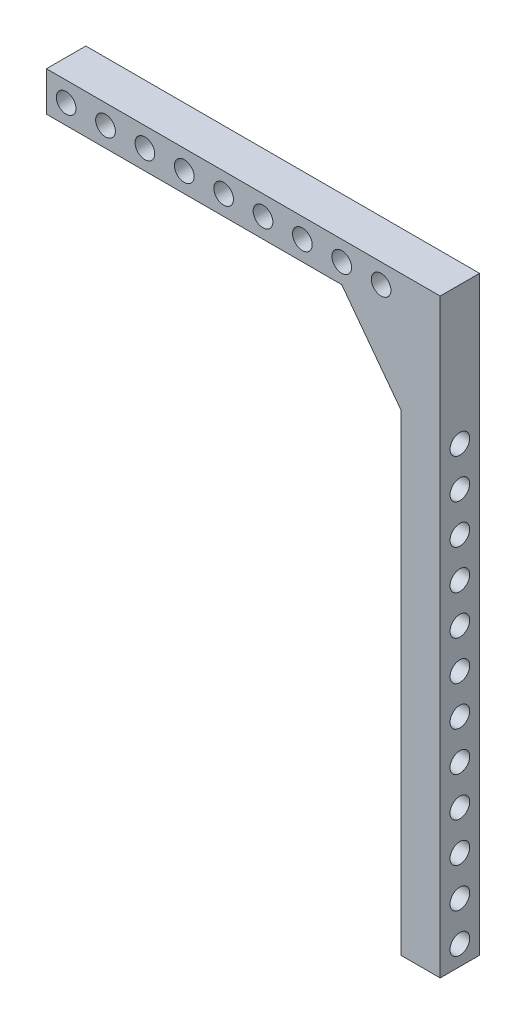
ISO-10303-21;
HEADER;
FILE_DESCRIPTION(('STEP AP214'),'2;1');
FILE_NAME('part.step','',(''),(''),'','','');
FILE_SCHEMA(('AUTOMOTIVE_DESIGN { 1 0 10303 214 1 1 1 1 }'));
ENDSEC;
DATA;
#1=APPLICATION_CONTEXT('core data for automotive mechanical design processes');
#2=APPLICATION_PROTOCOL_DEFINITION('international standard','automotive_design',2000,#1);
#3=PRODUCT_CONTEXT('',#1,'mechanical');
#4=PRODUCT('Part','Part','',(#3));
#5=PRODUCT_RELATED_PRODUCT_CATEGORY('part','',(#4));
#6=PRODUCT_DEFINITION_FORMATION('','',#4);
#7=PRODUCT_DEFINITION_CONTEXT('part definition',#1,'design');
#8=PRODUCT_DEFINITION('design','',#6,#7);
#9=PRODUCT_DEFINITION_SHAPE('','',#8);
#10=(LENGTH_UNIT() NAMED_UNIT(*) SI_UNIT(.MILLI.,.METRE.));
#11=(NAMED_UNIT(*) PLANE_ANGLE_UNIT() SI_UNIT($,.RADIAN.));
#12=(NAMED_UNIT(*) SI_UNIT($,.STERADIAN.) SOLID_ANGLE_UNIT());
#13=UNCERTAINTY_MEASURE_WITH_UNIT(LENGTH_MEASURE(1.E-05),#10,'distance_accuracy_value','');
#14=(GEOMETRIC_REPRESENTATION_CONTEXT(3) GLOBAL_UNCERTAINTY_ASSIGNED_CONTEXT((#13)) GLOBAL_UNIT_ASSIGNED_CONTEXT((#10,
#11,#12)) REPRESENTATION_CONTEXT('',''));
#15=CARTESIAN_POINT('',(0.,0.,0.));
#16=DIRECTION('',(0.,0.,1.));
#17=DIRECTION('',(1.,0.,0.));
#18=AXIS2_PLACEMENT_3D('',#15,#16,#17);
#19=CARTESIAN_POINT('',(90.,-5.,-5.));
#20=DIRECTION('',(0.,0.,1.));
#21=DIRECTION('',(1.,0.,0.));
#22=AXIS2_PLACEMENT_3D('',#19,#20,#21);
#23=PLANE('',#22);
#24=DIRECTION('',(-0.6,0.8,0.));
#25=VECTOR('',#24,1.);
#26=CARTESIAN_POINT('',(75.,-5.,-5.));
#27=LINE('',#26,#25);
#28=CARTESIAN_POINT('',(90.,-25.,-5.));
#29=VERTEX_POINT('',#28);
#30=CARTESIAN_POINT('',(75.,-5.,-5.));
#31=VERTEX_POINT('',#30);
#32=EDGE_CURVE('E102',#29,#31,#27,.T.);
#33=ORIENTED_EDGE('',*,*,#32,.T.);
#34=DIRECTION('',(-1.,0.,0.));
#35=VECTOR('',#34,1.);
#36=CARTESIAN_POINT('',(90.,-5.,-5.));
#37=LINE('',#36,#35);
#38=CARTESIAN_POINT('',(0.,-5.,-5.));
#39=VERTEX_POINT('',#38);
#40=EDGE_CURVE('E67',#31,#39,#37,.T.);
#41=ORIENTED_EDGE('',*,*,#40,.T.);
#42=DIRECTION('',(0.,1.,0.));
#43=VECTOR('',#42,1.);
#44=CARTESIAN_POINT('',(0.,-5.,-5.));
#45=LINE('',#44,#43);
#46=CARTESIAN_POINT('',(0.,5.,-5.));
#47=VERTEX_POINT('',#46);
#48=EDGE_CURVE('E135',#39,#47,#45,.T.);
#49=ORIENTED_EDGE('',*,*,#48,.T.);
#50=DIRECTION('',(-1.,0.,0.));
#51=VECTOR('',#50,1.);
#52=CARTESIAN_POINT('',(90.,5.,-5.));
#53=LINE('',#52,#51);
#54=CARTESIAN_POINT('',(100.,5.,-5.));
#55=VERTEX_POINT('',#54);
#56=EDGE_CURVE('E13',#55,#47,#53,.T.);
#57=ORIENTED_EDGE('',*,*,#56,.F.);
#58=DIRECTION('',(0.,1.,0.));
#59=VECTOR('',#58,1.);
#60=CARTESIAN_POINT('',(100.,5.,-5.));
#61=LINE('',#60,#59);
#62=CARTESIAN_POINT('',(100.,-145.,-5.00000000000002));
#63=VERTEX_POINT('',#62);
#64=EDGE_CURVE('E294',#63,#55,#61,.T.);
#65=ORIENTED_EDGE('',*,*,#64,.F.);
#66=DIRECTION('',(-1.,0.,0.));
#67=VECTOR('',#66,1.);
#68=CARTESIAN_POINT('',(100.,-145.,-5.00000000000002));
#69=LINE('',#68,#67);
#70=CARTESIAN_POINT('',(90.,-145.,-5.00000000000002));
#71=VERTEX_POINT('',#70);
#72=EDGE_CURVE('E120',#63,#71,#69,.T.);
#73=ORIENTED_EDGE('',*,*,#72,.T.);
#74=DIRECTION('',(0.,1.,0.));
#75=VECTOR('',#74,1.);
#76=CARTESIAN_POINT('',(90.,5.,-5.));
#77=LINE('',#76,#75);
#78=EDGE_CURVE('E113',#71,#29,#77,.T.);
#79=ORIENTED_EDGE('',*,*,#78,.T.);
#80=EDGE_LOOP('',(#33,#41,#49,#57,#65,#73,#79));
#81=FACE_BOUND('',#80,.T.);
#82=CARTESIAN_POINT('',(15.,0.,-5.));
#83=DIRECTION('',(0.,0.,-1.));
#84=DIRECTION('',(-1.,0.,0.));
#85=AXIS2_PLACEMENT_3D('',#82,#83,#84);
#86=CIRCLE('',#85,2.5);
#87=CARTESIAN_POINT('',(12.5,0.,-5.));
#88=VERTEX_POINT('',#87);
#89=EDGE_CURVE('E171',#88,#88,#86,.T.);
#90=ORIENTED_EDGE('',*,*,#89,.F.);
#91=EDGE_LOOP('',(#90));
#92=FACE_BOUND('',#91,.T.);
#93=CARTESIAN_POINT('',(25.,-1.40271576953299E-13,-5.));
#94=DIRECTION('',(0.,0.,-1.));
#95=DIRECTION('',(-1.,0.,0.));
#96=AXIS2_PLACEMENT_3D('',#93,#94,#95);
#97=CIRCLE('',#96,2.5);
#98=CARTESIAN_POINT('',(22.5,-1.40271576953299E-13,-5.));
#99=VERTEX_POINT('',#98);
#100=EDGE_CURVE('E179',#99,#99,#97,.T.);
#101=ORIENTED_EDGE('',*,*,#100,.F.);
#102=EDGE_LOOP('',(#101));
#103=FACE_BOUND('',#102,.T.);
#104=CARTESIAN_POINT('',(35.,-2.10101203730162E-13,-5.));
#105=DIRECTION('',(0.,0.,-1.));
#106=DIRECTION('',(-1.,0.,0.));
#107=AXIS2_PLACEMENT_3D('',#104,#105,#106);
#108=CIRCLE('',#107,2.5);
#109=CARTESIAN_POINT('',(32.5,-2.10101203730162E-13,-5.));
#110=VERTEX_POINT('',#109);
#111=EDGE_CURVE('E185',#110,#110,#108,.T.);
#112=ORIENTED_EDGE('',*,*,#111,.F.);
#113=EDGE_LOOP('',(#112));
#114=FACE_BOUND('',#113,.T.);
#115=CARTESIAN_POINT('',(45.,-2.79930830507024E-13,-5.));
#116=DIRECTION('',(0.,0.,-1.));
#117=DIRECTION('',(-1.,0.,0.));
#118=AXIS2_PLACEMENT_3D('',#115,#116,#117);
#119=CIRCLE('',#118,2.5);
#120=CARTESIAN_POINT('',(42.5,-2.79930830507024E-13,-5.));
#121=VERTEX_POINT('',#120);
#122=EDGE_CURVE('E191',#121,#121,#119,.T.);
#123=ORIENTED_EDGE('',*,*,#122,.F.);
#124=EDGE_LOOP('',(#123));
#125=FACE_BOUND('',#124,.T.);
#126=CARTESIAN_POINT('',(55.,-3.49760457283887E-13,-5.));
#127=DIRECTION('',(0.,0.,-1.));
#128=DIRECTION('',(-1.,0.,0.));
#129=AXIS2_PLACEMENT_3D('',#126,#127,#128);
#130=CIRCLE('',#129,2.5);
#131=CARTESIAN_POINT('',(52.5,-3.49760457283887E-13,-5.));
#132=VERTEX_POINT('',#131);
#133=EDGE_CURVE('E197',#132,#132,#130,.T.);
#134=ORIENTED_EDGE('',*,*,#133,.F.);
#135=EDGE_LOOP('',(#134));
#136=FACE_BOUND('',#135,.T.);
#137=CARTESIAN_POINT('',(65.,-4.1959008406075E-13,-5.));
#138=DIRECTION('',(0.,0.,-1.));
#139=DIRECTION('',(-1.,0.,0.));
#140=AXIS2_PLACEMENT_3D('',#137,#138,#139);
#141=CIRCLE('',#140,2.50000000000001);
#142=CARTESIAN_POINT('',(62.5,-4.1959008406075E-13,-5.));
#143=VERTEX_POINT('',#142);
#144=EDGE_CURVE('E203',#143,#143,#141,.T.);
#145=ORIENTED_EDGE('',*,*,#144,.F.);
#146=EDGE_LOOP('',(#145));
#147=FACE_BOUND('',#146,.T.);
#148=CARTESIAN_POINT('',(75.,-4.89419710837612E-13,-5.));
#149=DIRECTION('',(0.,0.,-1.));
#150=DIRECTION('',(-1.,0.,0.));
#151=AXIS2_PLACEMENT_3D('',#148,#149,#150);
#152=CIRCLE('',#151,2.50000000000001);
#153=CARTESIAN_POINT('',(72.5,-4.89419710837612E-13,-5.));
#154=VERTEX_POINT('',#153);
#155=EDGE_CURVE('E209',#154,#154,#152,.T.);
#156=ORIENTED_EDGE('',*,*,#155,.F.);
#157=EDGE_LOOP('',(#156));
#158=FACE_BOUND('',#157,.T.);
#159=CARTESIAN_POINT('',(85.,-5.59249337614475E-13,-5.));
#160=DIRECTION('',(0.,0.,-1.));
#161=DIRECTION('',(-1.,0.,0.));
#162=AXIS2_PLACEMENT_3D('',#159,#160,#161);
#163=CIRCLE('',#162,2.50000000000001);
#164=CARTESIAN_POINT('',(82.5,-5.59249337614475E-13,-5.));
#165=VERTEX_POINT('',#164);
#166=EDGE_CURVE('E164',#165,#165,#163,.T.);
#167=ORIENTED_EDGE('',*,*,#166,.F.);
#168=EDGE_LOOP('',(#167));
#169=FACE_BOUND('',#168,.T.);
#170=CARTESIAN_POINT('',(5.,0.,-5.));
#171=DIRECTION('',(0.,0.,-1.));
#172=DIRECTION('',(-1.,0.,0.));
#173=AXIS2_PLACEMENT_3D('',#170,#171,#172);
#174=CIRCLE('',#173,2.5);
#175=CARTESIAN_POINT('',(2.5,0.,-5.));
#176=VERTEX_POINT('',#175);
#177=EDGE_CURVE('E178',#176,#176,#174,.T.);
#178=ORIENTED_EDGE('',*,*,#177,.F.);
#179=EDGE_LOOP('',(#178));
#180=FACE_BOUND('',#179,.T.);
#181=ADVANCED_FACE('F45',(#81,#92,#103,#114,#125,#136,#147,#158,#169,#180),#23,.F.);
#182=CARTESIAN_POINT('',(90.,5.,5.));
#183=DIRECTION('',(0.,-1.,0.));
#184=DIRECTION('',(0.,0.,-1.));
#185=AXIS2_PLACEMENT_3D('',#182,#183,#184);
#186=PLANE('',#185);
#187=DIRECTION('',(0.,0.,1.));
#188=VECTOR('',#187,1.);
#189=CARTESIAN_POINT('',(0.,5.,5.));
#190=LINE('',#189,#188);
#191=CARTESIAN_POINT('',(0.,5.,5.));
#192=VERTEX_POINT('',#191);
#193=EDGE_CURVE('E137',#47,#192,#190,.T.);
#194=ORIENTED_EDGE('',*,*,#193,.T.);
#195=DIRECTION('',(-1.,0.,0.));
#196=VECTOR('',#195,1.);
#197=CARTESIAN_POINT('',(90.,5.,5.));
#198=LINE('',#197,#196);
#199=CARTESIAN_POINT('',(100.,5.,5.));
#200=VERTEX_POINT('',#199);
#201=EDGE_CURVE('E52',#200,#192,#198,.T.);
#202=ORIENTED_EDGE('',*,*,#201,.F.);
#203=DIRECTION('',(0.,0.,1.));
#204=VECTOR('',#203,1.);
#205=CARTESIAN_POINT('',(100.,5.,5.));
#206=LINE('',#205,#204);
#207=EDGE_CURVE('E132',#55,#200,#206,.T.);
#208=ORIENTED_EDGE('',*,*,#207,.F.);
#209=ORIENTED_EDGE('',*,*,#56,.T.);
#210=EDGE_LOOP('',(#194,#202,#208,#209));
#211=FACE_BOUND('',#210,.T.);
#212=ADVANCED_FACE('F300',(#211),#186,.F.);
#213=CARTESIAN_POINT('',(90.,-5.,5.));
#214=DIRECTION('',(0.,0.,-1.));
#215=DIRECTION('',(-1.,0.,0.));
#216=AXIS2_PLACEMENT_3D('',#213,#214,#215);
#217=PLANE('',#216);
#218=DIRECTION('',(-1.,0.,0.));
#219=VECTOR('',#218,1.);
#220=CARTESIAN_POINT('',(90.,-5.,5.));
#221=LINE('',#220,#219);
#222=CARTESIAN_POINT('',(75.,-5.,5.));
#223=VERTEX_POINT('',#222);
#224=CARTESIAN_POINT('',(0.,-5.,5.));
#225=VERTEX_POINT('',#224);
#226=EDGE_CURVE('E145',#223,#225,#221,.T.);
#227=ORIENTED_EDGE('',*,*,#226,.F.);
#228=DIRECTION('',(0.6,-0.8,0.));
#229=VECTOR('',#228,1.);
#230=CARTESIAN_POINT('',(75.,-5.,5.));
#231=LINE('',#230,#229);
#232=CARTESIAN_POINT('',(90.,-25.,5.));
#233=VERTEX_POINT('',#232);
#234=EDGE_CURVE('E163',#223,#233,#231,.T.);
#235=ORIENTED_EDGE('',*,*,#234,.T.);
#236=DIRECTION('',(0.,-1.,0.));
#237=VECTOR('',#236,1.);
#238=CARTESIAN_POINT('',(90.,5.,5.));
#239=LINE('',#238,#237);
#240=CARTESIAN_POINT('',(90.,-145.,4.99999999999998));
#241=VERTEX_POINT('',#240);
#242=EDGE_CURVE('E114',#233,#241,#239,.T.);
#243=ORIENTED_EDGE('',*,*,#242,.T.);
#244=DIRECTION('',(-1.,0.,0.));
#245=VECTOR('',#244,1.);
#246=CARTESIAN_POINT('',(100.,-145.,4.99999999999998));
#247=LINE('',#246,#245);
#248=CARTESIAN_POINT('',(100.,-145.,4.99999999999998));
#249=VERTEX_POINT('',#248);
#250=EDGE_CURVE('E131',#249,#241,#247,.T.);
#251=ORIENTED_EDGE('',*,*,#250,.F.);
#252=DIRECTION('',(0.,-1.,0.));
#253=VECTOR('',#252,1.);
#254=CARTESIAN_POINT('',(100.,5.,5.));
#255=LINE('',#254,#253);
#256=EDGE_CURVE('E121',#200,#249,#255,.T.);
#257=ORIENTED_EDGE('',*,*,#256,.F.);
#258=ORIENTED_EDGE('',*,*,#201,.T.);
#259=DIRECTION('',(0.,-1.,0.));
#260=VECTOR('',#259,1.);
#261=CARTESIAN_POINT('',(0.,-5.,5.));
#262=LINE('',#261,#260);
#263=EDGE_CURVE('E139',#192,#225,#262,.T.);
#264=ORIENTED_EDGE('',*,*,#263,.T.);
#265=EDGE_LOOP('',(#227,#235,#243,#251,#257,#258,#264));
#266=FACE_BOUND('',#265,.T.);
#267=CARTESIAN_POINT('',(15.,0.,5.));
#268=DIRECTION('',(0.,0.,-1.));
#269=DIRECTION('',(-1.,0.,0.));
#270=AXIS2_PLACEMENT_3D('',#267,#268,#269);
#271=CIRCLE('',#270,2.5);
#272=CARTESIAN_POINT('',(12.5,0.,5.));
#273=VERTEX_POINT('',#272);
#274=EDGE_CURVE('E174',#273,#273,#271,.F.);
#275=ORIENTED_EDGE('',*,*,#274,.F.);
#276=EDGE_LOOP('',(#275));
#277=FACE_BOUND('',#276,.T.);
#278=CARTESIAN_POINT('',(25.,-1.40271576953299E-13,5.));
#279=DIRECTION('',(0.,0.,-1.));
#280=DIRECTION('',(-1.,0.,0.));
#281=AXIS2_PLACEMENT_3D('',#278,#279,#280);
#282=CIRCLE('',#281,2.5);
#283=CARTESIAN_POINT('',(22.5,-1.40271576953299E-13,5.));
#284=VERTEX_POINT('',#283);
#285=EDGE_CURVE('E175',#284,#284,#282,.F.);
#286=ORIENTED_EDGE('',*,*,#285,.F.);
#287=EDGE_LOOP('',(#286));
#288=FACE_BOUND('',#287,.T.);
#289=CARTESIAN_POINT('',(35.,-2.10101203730162E-13,5.));
#290=DIRECTION('',(0.,0.,-1.));
#291=DIRECTION('',(-1.,0.,0.));
#292=AXIS2_PLACEMENT_3D('',#289,#290,#291);
#293=CIRCLE('',#292,2.5);
#294=CARTESIAN_POINT('',(32.5,-2.10101203730162E-13,5.));
#295=VERTEX_POINT('',#294);
#296=EDGE_CURVE('E182',#295,#295,#293,.F.);
#297=ORIENTED_EDGE('',*,*,#296,.F.);
#298=EDGE_LOOP('',(#297));
#299=FACE_BOUND('',#298,.T.);
#300=CARTESIAN_POINT('',(45.,-2.79930830507024E-13,5.));
#301=DIRECTION('',(0.,0.,-1.));
#302=DIRECTION('',(-1.,0.,0.));
#303=AXIS2_PLACEMENT_3D('',#300,#301,#302);
#304=CIRCLE('',#303,2.5);
#305=CARTESIAN_POINT('',(42.5,-2.79930830507024E-13,5.));
#306=VERTEX_POINT('',#305);
#307=EDGE_CURVE('E188',#306,#306,#304,.F.);
#308=ORIENTED_EDGE('',*,*,#307,.F.);
#309=EDGE_LOOP('',(#308));
#310=FACE_BOUND('',#309,.T.);
#311=CARTESIAN_POINT('',(55.,-3.49760457283887E-13,5.));
#312=DIRECTION('',(0.,0.,-1.));
#313=DIRECTION('',(-1.,0.,0.));
#314=AXIS2_PLACEMENT_3D('',#311,#312,#313);
#315=CIRCLE('',#314,2.5);
#316=CARTESIAN_POINT('',(52.5,-3.49760457283887E-13,5.));
#317=VERTEX_POINT('',#316);
#318=EDGE_CURVE('E194',#317,#317,#315,.F.);
#319=ORIENTED_EDGE('',*,*,#318,.F.);
#320=EDGE_LOOP('',(#319));
#321=FACE_BOUND('',#320,.T.);
#322=CARTESIAN_POINT('',(65.,-4.1959008406075E-13,5.));
#323=DIRECTION('',(0.,0.,-1.));
#324=DIRECTION('',(-1.,0.,0.));
#325=AXIS2_PLACEMENT_3D('',#322,#323,#324);
#326=CIRCLE('',#325,2.50000000000001);
#327=CARTESIAN_POINT('',(62.5,-4.1959008406075E-13,5.));
#328=VERTEX_POINT('',#327);
#329=EDGE_CURVE('E200',#328,#328,#326,.F.);
#330=ORIENTED_EDGE('',*,*,#329,.F.);
#331=EDGE_LOOP('',(#330));
#332=FACE_BOUND('',#331,.T.);
#333=CARTESIAN_POINT('',(75.,-4.89419710837612E-13,5.));
#334=DIRECTION('',(0.,0.,-1.));
#335=DIRECTION('',(-1.,0.,0.));
#336=AXIS2_PLACEMENT_3D('',#333,#334,#335);
#337=CIRCLE('',#336,2.50000000000001);
#338=CARTESIAN_POINT('',(72.5,-4.89419710837612E-13,5.));
#339=VERTEX_POINT('',#338);
#340=EDGE_CURVE('E206',#339,#339,#337,.F.);
#341=ORIENTED_EDGE('',*,*,#340,.F.);
#342=EDGE_LOOP('',(#341));
#343=FACE_BOUND('',#342,.T.);
#344=CARTESIAN_POINT('',(85.,-5.59249337614475E-13,5.));
#345=DIRECTION('',(0.,0.,-1.));
#346=DIRECTION('',(-1.,0.,0.));
#347=AXIS2_PLACEMENT_3D('',#344,#345,#346);
#348=CIRCLE('',#347,2.50000000000001);
#349=CARTESIAN_POINT('',(82.5,-5.59249337614475E-13,5.));
#350=VERTEX_POINT('',#349);
#351=EDGE_CURVE('E167',#350,#350,#348,.F.);
#352=ORIENTED_EDGE('',*,*,#351,.F.);
#353=EDGE_LOOP('',(#352));
#354=FACE_BOUND('',#353,.T.);
#355=CARTESIAN_POINT('',(5.,0.,5.));
#356=DIRECTION('',(0.,0.,-1.));
#357=DIRECTION('',(-1.,0.,0.));
#358=AXIS2_PLACEMENT_3D('',#355,#356,#357);
#359=CIRCLE('',#358,2.5);
#360=CARTESIAN_POINT('',(2.5,0.,5.));
#361=VERTEX_POINT('',#360);
#362=EDGE_CURVE('E218',#361,#361,#359,.F.);
#363=ORIENTED_EDGE('',*,*,#362,.F.);
#364=EDGE_LOOP('',(#363));
#365=FACE_BOUND('',#364,.T.);
#366=ADVANCED_FACE('F151',(#266,#277,#288,#299,#310,#321,#332,#343,#354,#365),#217,.F.);
#367=CARTESIAN_POINT('',(90.,-5.,5.));
#368=DIRECTION('',(0.,1.,0.));
#369=DIRECTION('',(0.,0.,1.));
#370=AXIS2_PLACEMENT_3D('',#367,#368,#369);
#371=PLANE('',#370);
#372=ORIENTED_EDGE('',*,*,#40,.F.);
#373=DIRECTION('',(0.,0.,-1.));
#374=VECTOR('',#373,1.);
#375=CARTESIAN_POINT('',(75.,-5.,30.));
#376=LINE('',#375,#374);
#377=EDGE_CURVE('E105',#223,#31,#376,.T.);
#378=ORIENTED_EDGE('',*,*,#377,.F.);
#379=ORIENTED_EDGE('',*,*,#226,.T.);
#380=DIRECTION('',(0.,0.,-1.));
#381=VECTOR('',#380,1.);
#382=CARTESIAN_POINT('',(0.,-5.,5.));
#383=LINE('',#382,#381);
#384=EDGE_CURVE('E142',#225,#39,#383,.T.);
#385=ORIENTED_EDGE('',*,*,#384,.T.);
#386=EDGE_LOOP('',(#372,#378,#379,#385));
#387=FACE_BOUND('',#386,.T.);
#388=ADVANCED_FACE('F162',(#387),#371,.F.);
#389=CARTESIAN_POINT('',(0.,0.,0.));
#390=DIRECTION('',(-1.,0.,0.));
#391=DIRECTION('',(0.,0.,1.));
#392=AXIS2_PLACEMENT_3D('',#389,#390,#391);
#393=PLANE('',#392);
#394=ORIENTED_EDGE('',*,*,#48,.F.);
#395=ORIENTED_EDGE('',*,*,#384,.F.);
#396=ORIENTED_EDGE('',*,*,#263,.F.);
#397=ORIENTED_EDGE('',*,*,#193,.F.);
#398=EDGE_LOOP('',(#394,#395,#396,#397));
#399=FACE_BOUND('',#398,.T.);
#400=ADVANCED_FACE('F160',(#399),#393,.T.);
#401=CARTESIAN_POINT('',(90.,0.,0.));
#402=DIRECTION('',(1.,0.,0.));
#403=DIRECTION('',(0.,0.,-1.));
#404=AXIS2_PLACEMENT_3D('',#401,#402,#403);
#405=PLANE('',#404);
#406=CARTESIAN_POINT('',(90.,-140.,0.));
#407=DIRECTION('',(1.,0.,0.));
#408=DIRECTION('',(0.,0.,-1.));
#409=AXIS2_PLACEMENT_3D('',#406,#407,#408);
#410=CIRCLE('',#409,2.5);
#411=CARTESIAN_POINT('',(90.,-140.,-2.5));
#412=VERTEX_POINT('',#411);
#413=EDGE_CURVE('E285',#412,#412,#410,.T.);
#414=ORIENTED_EDGE('',*,*,#413,.T.);
#415=EDGE_LOOP('',(#414));
#416=FACE_BOUND('',#415,.T.);
#417=CARTESIAN_POINT('',(90.,-40.,3.49148133884313E-13));
#418=DIRECTION('',(1.,0.,0.));
#419=DIRECTION('',(0.,0.,-1.));
#420=AXIS2_PLACEMENT_3D('',#417,#418,#419);
#421=CIRCLE('',#420,2.5);
#422=CARTESIAN_POINT('',(90.,-40.,-2.49999999999965));
#423=VERTEX_POINT('',#422);
#424=EDGE_CURVE('E279',#423,#423,#421,.T.);
#425=ORIENTED_EDGE('',*,*,#424,.T.);
#426=EDGE_LOOP('',(#425));
#427=FACE_BOUND('',#426,.T.);
#428=CARTESIAN_POINT('',(90.,-130.,0.));
#429=DIRECTION('',(1.,0.,0.));
#430=DIRECTION('',(0.,0.,-1.));
#431=AXIS2_PLACEMENT_3D('',#428,#429,#430);
#432=CIRCLE('',#431,2.5);
#433=CARTESIAN_POINT('',(90.,-130.,-2.49999999999997));
#434=VERTEX_POINT('',#433);
#435=EDGE_CURVE('E273',#434,#434,#432,.T.);
#436=ORIENTED_EDGE('',*,*,#435,.T.);
#437=EDGE_LOOP('',(#436));
#438=FACE_BOUND('',#437,.T.);
#439=CARTESIAN_POINT('',(90.,-120.,0.));
#440=DIRECTION('',(1.,0.,0.));
#441=DIRECTION('',(0.,0.,-1.));
#442=AXIS2_PLACEMENT_3D('',#439,#440,#441);
#443=CIRCLE('',#442,2.5);
#444=CARTESIAN_POINT('',(90.,-120.,-2.49999999999993));
#445=VERTEX_POINT('',#444);
#446=EDGE_CURVE('E267',#445,#445,#443,.T.);
#447=ORIENTED_EDGE('',*,*,#446,.T.);
#448=EDGE_LOOP('',(#447));
#449=FACE_BOUND('',#448,.T.);
#450=CARTESIAN_POINT('',(90.,-110.,1.04744440165294E-13));
#451=DIRECTION('',(1.,0.,0.));
#452=DIRECTION('',(0.,0.,-1.));
#453=AXIS2_PLACEMENT_3D('',#450,#451,#452);
#454=CIRCLE('',#453,2.5);
#455=CARTESIAN_POINT('',(90.,-110.,-2.4999999999999));
#456=VERTEX_POINT('',#455);
#457=EDGE_CURVE('E261',#456,#456,#454,.T.);
#458=ORIENTED_EDGE('',*,*,#457,.T.);
#459=EDGE_LOOP('',(#458));
#460=FACE_BOUND('',#459,.T.);
#461=CARTESIAN_POINT('',(90.,-100.,1.39659253553725E-13));
#462=DIRECTION('',(1.,0.,0.));
#463=DIRECTION('',(0.,0.,-1.));
#464=AXIS2_PLACEMENT_3D('',#461,#462,#463);
#465=CIRCLE('',#464,2.5);
#466=CARTESIAN_POINT('',(90.,-100.,-2.49999999999986));
#467=VERTEX_POINT('',#466);
#468=EDGE_CURVE('E255',#467,#467,#465,.T.);
#469=ORIENTED_EDGE('',*,*,#468,.T.);
#470=EDGE_LOOP('',(#469));
#471=FACE_BOUND('',#470,.T.);
#472=CARTESIAN_POINT('',(90.,-90.,1.74574066942157E-13));
#473=DIRECTION('',(1.,0.,0.));
#474=DIRECTION('',(0.,0.,-1.));
#475=AXIS2_PLACEMENT_3D('',#472,#473,#474);
#476=CIRCLE('',#475,2.5);
#477=CARTESIAN_POINT('',(90.,-90.,-2.49999999999983));
#478=VERTEX_POINT('',#477);
#479=EDGE_CURVE('E249',#478,#478,#476,.T.);
#480=ORIENTED_EDGE('',*,*,#479,.T.);
#481=EDGE_LOOP('',(#480));
#482=FACE_BOUND('',#481,.T.);
#483=CARTESIAN_POINT('',(90.,-80.,2.09488880330588E-13));
#484=DIRECTION('',(1.,0.,0.));
#485=DIRECTION('',(0.,0.,-1.));
#486=AXIS2_PLACEMENT_3D('',#483,#484,#485);
#487=CIRCLE('',#486,2.5);
#488=CARTESIAN_POINT('',(90.,-80.,-2.49999999999979));
#489=VERTEX_POINT('',#488);
#490=EDGE_CURVE('E243',#489,#489,#487,.T.);
#491=ORIENTED_EDGE('',*,*,#490,.T.);
#492=EDGE_LOOP('',(#491));
#493=FACE_BOUND('',#492,.T.);
#494=CARTESIAN_POINT('',(90.,-70.,2.44403693719019E-13));
#495=DIRECTION('',(1.,0.,0.));
#496=DIRECTION('',(0.,0.,-1.));
#497=AXIS2_PLACEMENT_3D('',#494,#495,#496);
#498=CIRCLE('',#497,2.5);
#499=CARTESIAN_POINT('',(90.,-70.,-2.49999999999976));
#500=VERTEX_POINT('',#499);
#501=EDGE_CURVE('E237',#500,#500,#498,.T.);
#502=ORIENTED_EDGE('',*,*,#501,.T.);
#503=EDGE_LOOP('',(#502));
#504=FACE_BOUND('',#503,.T.);
#505=CARTESIAN_POINT('',(90.,-60.,2.79318507107451E-13));
#506=DIRECTION('',(1.,0.,0.));
#507=DIRECTION('',(0.,0.,-1.));
#508=AXIS2_PLACEMENT_3D('',#505,#506,#507);
#509=CIRCLE('',#508,2.5);
#510=CARTESIAN_POINT('',(90.,-60.,-2.49999999999972));
#511=VERTEX_POINT('',#510);
#512=EDGE_CURVE('E231',#511,#511,#509,.T.);
#513=ORIENTED_EDGE('',*,*,#512,.T.);
#514=EDGE_LOOP('',(#513));
#515=FACE_BOUND('',#514,.T.);
#516=CARTESIAN_POINT('',(90.,-50.,3.14233320495882E-13));
#517=DIRECTION('',(1.,0.,0.));
#518=DIRECTION('',(0.,0.,-1.));
#519=AXIS2_PLACEMENT_3D('',#516,#517,#518);
#520=CIRCLE('',#519,2.5);
#521=CARTESIAN_POINT('',(90.,-50.,-2.49999999999969));
#522=VERTEX_POINT('',#521);
#523=EDGE_CURVE('E225',#522,#522,#520,.T.);
#524=ORIENTED_EDGE('',*,*,#523,.T.);
#525=EDGE_LOOP('',(#524));
#526=FACE_BOUND('',#525,.T.);
#527=CARTESIAN_POINT('',(90.,-30.,3.84062947272745E-13));
#528=DIRECTION('',(1.,0.,0.));
#529=DIRECTION('',(0.,0.,-1.));
#530=AXIS2_PLACEMENT_3D('',#527,#528,#529);
#531=CIRCLE('',#530,2.5);
#532=CARTESIAN_POINT('',(90.,-30.,-2.49999999999962));
#533=VERTEX_POINT('',#532);
#534=EDGE_CURVE('E221',#533,#533,#531,.T.);
#535=ORIENTED_EDGE('',*,*,#534,.T.);
#536=EDGE_LOOP('',(#535));
#537=FACE_BOUND('',#536,.T.);
#538=ORIENTED_EDGE('',*,*,#242,.F.);
#539=DIRECTION('',(0.,0.,-1.));
#540=VECTOR('',#539,1.);
#541=CARTESIAN_POINT('',(90.,-25.,30.));
#542=LINE('',#541,#540);
#543=EDGE_CURVE('E59',#233,#29,#542,.T.);
#544=ORIENTED_EDGE('',*,*,#543,.T.);
#545=ORIENTED_EDGE('',*,*,#78,.F.);
#546=DIRECTION('',(0.,0.,-1.));
#547=VECTOR('',#546,1.);
#548=CARTESIAN_POINT('',(90.,-145.,4.99999999999998));
#549=LINE('',#548,#547);
#550=EDGE_CURVE('E122',#241,#71,#549,.T.);
#551=ORIENTED_EDGE('',*,*,#550,.F.);
#552=EDGE_LOOP('',(#538,#544,#545,#551));
#553=FACE_BOUND('',#552,.T.);
#554=ADVANCED_FACE('F111',(#416,#427,#438,#449,#460,#471,#482,#493,#504,#515,#526,#537,#553),
#405,.F.);
#555=CARTESIAN_POINT('',(100.,0.,0.));
#556=DIRECTION('',(1.,0.,0.));
#557=DIRECTION('',(0.,0.,-1.));
#558=AXIS2_PLACEMENT_3D('',#555,#556,#557);
#559=PLANE('',#558);
#560=CARTESIAN_POINT('',(100.,-50.,3.14233320495882E-13));
#561=DIRECTION('',(1.,0.,0.));
#562=DIRECTION('',(0.,0.,-1.));
#563=AXIS2_PLACEMENT_3D('',#560,#561,#562);
#564=CIRCLE('',#563,2.5);
#565=CARTESIAN_POINT('',(100.,-50.,-2.49999999999969));
#566=VERTEX_POINT('',#565);
#567=EDGE_CURVE('E228',#566,#566,#564,.T.);
#568=ORIENTED_EDGE('',*,*,#567,.F.);
#569=EDGE_LOOP('',(#568));
#570=FACE_BOUND('',#569,.T.);
#571=CARTESIAN_POINT('',(100.,-70.,2.44403693719019E-13));
#572=DIRECTION('',(1.,0.,0.));
#573=DIRECTION('',(0.,0.,-1.));
#574=AXIS2_PLACEMENT_3D('',#571,#572,#573);
#575=CIRCLE('',#574,2.5);
#576=CARTESIAN_POINT('',(100.,-70.,-2.49999999999976));
#577=VERTEX_POINT('',#576);
#578=EDGE_CURVE('E240',#577,#577,#575,.T.);
#579=ORIENTED_EDGE('',*,*,#578,.F.);
#580=EDGE_LOOP('',(#579));
#581=FACE_BOUND('',#580,.T.);
#582=CARTESIAN_POINT('',(100.,-90.,1.74574066942157E-13));
#583=DIRECTION('',(1.,0.,0.));
#584=DIRECTION('',(0.,0.,-1.));
#585=AXIS2_PLACEMENT_3D('',#582,#583,#584);
#586=CIRCLE('',#585,2.5);
#587=CARTESIAN_POINT('',(100.,-90.,-2.49999999999983));
#588=VERTEX_POINT('',#587);
#589=EDGE_CURVE('E252',#588,#588,#586,.T.);
#590=ORIENTED_EDGE('',*,*,#589,.F.);
#591=EDGE_LOOP('',(#590));
#592=FACE_BOUND('',#591,.T.);
#593=CARTESIAN_POINT('',(100.,-110.,1.04744440165294E-13));
#594=DIRECTION('',(1.,0.,0.));
#595=DIRECTION('',(0.,0.,-1.));
#596=AXIS2_PLACEMENT_3D('',#593,#594,#595);
#597=CIRCLE('',#596,2.5);
#598=CARTESIAN_POINT('',(100.,-110.,-2.4999999999999));
#599=VERTEX_POINT('',#598);
#600=EDGE_CURVE('E264',#599,#599,#597,.T.);
#601=ORIENTED_EDGE('',*,*,#600,.F.);
#602=EDGE_LOOP('',(#601));
#603=FACE_BOUND('',#602,.T.);
#604=CARTESIAN_POINT('',(100.,-130.,0.));
#605=DIRECTION('',(1.,0.,0.));
#606=DIRECTION('',(0.,0.,-1.));
#607=AXIS2_PLACEMENT_3D('',#604,#605,#606);
#608=CIRCLE('',#607,2.5);
#609=CARTESIAN_POINT('',(100.,-130.,-2.49999999999997));
#610=VERTEX_POINT('',#609);
#611=EDGE_CURVE('E276',#610,#610,#608,.T.);
#612=ORIENTED_EDGE('',*,*,#611,.F.);
#613=EDGE_LOOP('',(#612));
#614=FACE_BOUND('',#613,.T.);
#615=CARTESIAN_POINT('',(100.,-140.,0.));
#616=DIRECTION('',(1.,0.,0.));
#617=DIRECTION('',(0.,0.,-1.));
#618=AXIS2_PLACEMENT_3D('',#615,#616,#617);
#619=CIRCLE('',#618,2.5);
#620=CARTESIAN_POINT('',(100.,-140.,-2.5));
#621=VERTEX_POINT('',#620);
#622=EDGE_CURVE('E288',#621,#621,#619,.T.);
#623=ORIENTED_EDGE('',*,*,#622,.F.);
#624=EDGE_LOOP('',(#623));
#625=FACE_BOUND('',#624,.T.);
#626=ORIENTED_EDGE('',*,*,#256,.T.);
#627=DIRECTION('',(0.,0.,-1.));
#628=VECTOR('',#627,1.);
#629=CARTESIAN_POINT('',(100.,-145.,4.99999999999998));
#630=LINE('',#629,#628);
#631=EDGE_CURVE('E125',#249,#63,#630,.T.);
#632=ORIENTED_EDGE('',*,*,#631,.T.);
#633=ORIENTED_EDGE('',*,*,#64,.T.);
#634=ORIENTED_EDGE('',*,*,#207,.T.);
#635=EDGE_LOOP('',(#626,#632,#633,#634));
#636=FACE_BOUND('',#635,.T.);
#637=CARTESIAN_POINT('',(100.,-40.,3.49148133884313E-13));
#638=DIRECTION('',(1.,0.,0.));
#639=DIRECTION('',(0.,0.,-1.));
#640=AXIS2_PLACEMENT_3D('',#637,#638,#639);
#641=CIRCLE('',#640,2.5);
#642=CARTESIAN_POINT('',(100.,-40.,-2.49999999999965));
#643=VERTEX_POINT('',#642);
#644=EDGE_CURVE('E282',#643,#643,#641,.T.);
#645=ORIENTED_EDGE('',*,*,#644,.F.);
#646=EDGE_LOOP('',(#645));
#647=FACE_BOUND('',#646,.T.);
#648=CARTESIAN_POINT('',(100.,-120.,0.));
#649=DIRECTION('',(1.,0.,0.));
#650=DIRECTION('',(0.,0.,-1.));
#651=AXIS2_PLACEMENT_3D('',#648,#649,#650);
#652=CIRCLE('',#651,2.5);
#653=CARTESIAN_POINT('',(100.,-120.,-2.49999999999993));
#654=VERTEX_POINT('',#653);
#655=EDGE_CURVE('E270',#654,#654,#652,.T.);
#656=ORIENTED_EDGE('',*,*,#655,.F.);
#657=EDGE_LOOP('',(#656));
#658=FACE_BOUND('',#657,.T.);
#659=CARTESIAN_POINT('',(100.,-100.,1.39659253553725E-13));
#660=DIRECTION('',(1.,0.,0.));
#661=DIRECTION('',(0.,0.,-1.));
#662=AXIS2_PLACEMENT_3D('',#659,#660,#661);
#663=CIRCLE('',#662,2.5);
#664=CARTESIAN_POINT('',(100.,-100.,-2.49999999999986));
#665=VERTEX_POINT('',#664);
#666=EDGE_CURVE('E258',#665,#665,#663,.T.);
#667=ORIENTED_EDGE('',*,*,#666,.F.);
#668=EDGE_LOOP('',(#667));
#669=FACE_BOUND('',#668,.T.);
#670=CARTESIAN_POINT('',(100.,-80.,2.09488880330588E-13));
#671=DIRECTION('',(1.,0.,0.));
#672=DIRECTION('',(0.,0.,-1.));
#673=AXIS2_PLACEMENT_3D('',#670,#671,#672);
#674=CIRCLE('',#673,2.5);
#675=CARTESIAN_POINT('',(100.,-80.,-2.49999999999979));
#676=VERTEX_POINT('',#675);
#677=EDGE_CURVE('E246',#676,#676,#674,.T.);
#678=ORIENTED_EDGE('',*,*,#677,.F.);
#679=EDGE_LOOP('',(#678));
#680=FACE_BOUND('',#679,.T.);
#681=CARTESIAN_POINT('',(100.,-60.,2.79318507107451E-13));
#682=DIRECTION('',(1.,0.,0.));
#683=DIRECTION('',(0.,0.,-1.));
#684=AXIS2_PLACEMENT_3D('',#681,#682,#683);
#685=CIRCLE('',#684,2.5);
#686=CARTESIAN_POINT('',(100.,-60.,-2.49999999999972));
#687=VERTEX_POINT('',#686);
#688=EDGE_CURVE('E234',#687,#687,#685,.T.);
#689=ORIENTED_EDGE('',*,*,#688,.F.);
#690=EDGE_LOOP('',(#689));
#691=FACE_BOUND('',#690,.T.);
#692=CARTESIAN_POINT('',(100.,-30.,3.84062947272745E-13));
#693=DIRECTION('',(1.,0.,0.));
#694=DIRECTION('',(0.,0.,-1.));
#695=AXIS2_PLACEMENT_3D('',#692,#693,#694);
#696=CIRCLE('',#695,2.5);
#697=CARTESIAN_POINT('',(100.,-30.,-2.49999999999962));
#698=VERTEX_POINT('',#697);
#699=EDGE_CURVE('E222',#698,#698,#696,.T.);
#700=ORIENTED_EDGE('',*,*,#699,.F.);
#701=EDGE_LOOP('',(#700));
#702=FACE_BOUND('',#701,.T.);
#703=ADVANCED_FACE('F298',(#570,#581,#592,#603,#614,#625,#636,#647,#658,#669,#680,#691,#702),
#559,.T.);
#704=CARTESIAN_POINT('',(100.,-145.,4.99999999999998));
#705=DIRECTION('',(0.,1.,0.));
#706=DIRECTION('',(0.,0.,1.));
#707=AXIS2_PLACEMENT_3D('',#704,#705,#706);
#708=PLANE('',#707);
#709=ORIENTED_EDGE('',*,*,#550,.T.);
#710=ORIENTED_EDGE('',*,*,#72,.F.);
#711=ORIENTED_EDGE('',*,*,#631,.F.);
#712=ORIENTED_EDGE('',*,*,#250,.T.);
#713=EDGE_LOOP('',(#709,#710,#711,#712));
#714=FACE_BOUND('',#713,.T.);
#715=ADVANCED_FACE('F312',(#714),#708,.F.);
#716=CARTESIAN_POINT('',(100.,-140.,0.));
#717=DIRECTION('',(-1.,0.,0.));
#718=DIRECTION('',(0.,0.,1.));
#719=AXIS2_PLACEMENT_3D('',#716,#717,#718);
#720=CYLINDRICAL_SURFACE('',#719,2.5);
#721=ORIENTED_EDGE('',*,*,#622,.T.);
#722=EDGE_LOOP('',(#721));
#723=FACE_BOUND('',#722,.T.);
#724=ORIENTED_EDGE('',*,*,#413,.F.);
#725=EDGE_LOOP('',(#724));
#726=FACE_BOUND('',#725,.T.);
#727=ADVANCED_FACE('F315',(#723,#726),#720,.F.);
#728=CARTESIAN_POINT('',(100.,-40.,3.49148133884313E-13));
#729=DIRECTION('',(-1.,0.,0.));
#730=DIRECTION('',(0.,0.,1.));
#731=AXIS2_PLACEMENT_3D('',#728,#729,#730);
#732=CYLINDRICAL_SURFACE('',#731,2.5);
#733=ORIENTED_EDGE('',*,*,#644,.T.);
#734=EDGE_LOOP('',(#733));
#735=FACE_BOUND('',#734,.T.);
#736=ORIENTED_EDGE('',*,*,#424,.F.);
#737=EDGE_LOOP('',(#736));
#738=FACE_BOUND('',#737,.T.);
#739=ADVANCED_FACE('F325',(#735,#738),#732,.F.);
#740=CARTESIAN_POINT('',(100.,-130.,0.));
#741=DIRECTION('',(-1.,0.,0.));
#742=DIRECTION('',(0.,0.,1.));
#743=AXIS2_PLACEMENT_3D('',#740,#741,#742);
#744=CYLINDRICAL_SURFACE('',#743,2.5);
#745=ORIENTED_EDGE('',*,*,#611,.T.);
#746=EDGE_LOOP('',(#745));
#747=FACE_BOUND('',#746,.T.);
#748=ORIENTED_EDGE('',*,*,#435,.F.);
#749=EDGE_LOOP('',(#748));
#750=FACE_BOUND('',#749,.T.);
#751=ADVANCED_FACE('F329',(#747,#750),#744,.F.);
#752=CARTESIAN_POINT('',(100.,-120.,0.));
#753=DIRECTION('',(-1.,0.,0.));
#754=DIRECTION('',(0.,0.,1.));
#755=AXIS2_PLACEMENT_3D('',#752,#753,#754);
#756=CYLINDRICAL_SURFACE('',#755,2.5);
#757=ORIENTED_EDGE('',*,*,#655,.T.);
#758=EDGE_LOOP('',(#757));
#759=FACE_BOUND('',#758,.T.);
#760=ORIENTED_EDGE('',*,*,#446,.F.);
#761=EDGE_LOOP('',(#760));
#762=FACE_BOUND('',#761,.T.);
#763=ADVANCED_FACE('F333',(#759,#762),#756,.F.);
#764=CARTESIAN_POINT('',(100.,-110.,1.04744440165294E-13));
#765=DIRECTION('',(-1.,0.,0.));
#766=DIRECTION('',(0.,0.,1.));
#767=AXIS2_PLACEMENT_3D('',#764,#765,#766);
#768=CYLINDRICAL_SURFACE('',#767,2.5);
#769=ORIENTED_EDGE('',*,*,#600,.T.);
#770=EDGE_LOOP('',(#769));
#771=FACE_BOUND('',#770,.T.);
#772=ORIENTED_EDGE('',*,*,#457,.F.);
#773=EDGE_LOOP('',(#772));
#774=FACE_BOUND('',#773,.T.);
#775=ADVANCED_FACE('F337',(#771,#774),#768,.F.);
#776=CARTESIAN_POINT('',(100.,-100.,1.39659253553725E-13));
#777=DIRECTION('',(-1.,0.,0.));
#778=DIRECTION('',(0.,0.,1.));
#779=AXIS2_PLACEMENT_3D('',#776,#777,#778);
#780=CYLINDRICAL_SURFACE('',#779,2.5);
#781=ORIENTED_EDGE('',*,*,#666,.T.);
#782=EDGE_LOOP('',(#781));
#783=FACE_BOUND('',#782,.T.);
#784=ORIENTED_EDGE('',*,*,#468,.F.);
#785=EDGE_LOOP('',(#784));
#786=FACE_BOUND('',#785,.T.);
#787=ADVANCED_FACE('F341',(#783,#786),#780,.F.);
#788=CARTESIAN_POINT('',(100.,-90.,1.74574066942157E-13));
#789=DIRECTION('',(-1.,0.,0.));
#790=DIRECTION('',(0.,0.,1.));
#791=AXIS2_PLACEMENT_3D('',#788,#789,#790);
#792=CYLINDRICAL_SURFACE('',#791,2.5);
#793=ORIENTED_EDGE('',*,*,#589,.T.);
#794=EDGE_LOOP('',(#793));
#795=FACE_BOUND('',#794,.T.);
#796=ORIENTED_EDGE('',*,*,#479,.F.);
#797=EDGE_LOOP('',(#796));
#798=FACE_BOUND('',#797,.T.);
#799=ADVANCED_FACE('F345',(#795,#798),#792,.F.);
#800=CARTESIAN_POINT('',(100.,-80.,2.09488880330588E-13));
#801=DIRECTION('',(-1.,0.,0.));
#802=DIRECTION('',(0.,0.,1.));
#803=AXIS2_PLACEMENT_3D('',#800,#801,#802);
#804=CYLINDRICAL_SURFACE('',#803,2.5);
#805=ORIENTED_EDGE('',*,*,#677,.T.);
#806=EDGE_LOOP('',(#805));
#807=FACE_BOUND('',#806,.T.);
#808=ORIENTED_EDGE('',*,*,#490,.F.);
#809=EDGE_LOOP('',(#808));
#810=FACE_BOUND('',#809,.T.);
#811=ADVANCED_FACE('F349',(#807,#810),#804,.F.);
#812=CARTESIAN_POINT('',(100.,-70.,2.44403693719019E-13));
#813=DIRECTION('',(-1.,0.,0.));
#814=DIRECTION('',(0.,0.,1.));
#815=AXIS2_PLACEMENT_3D('',#812,#813,#814);
#816=CYLINDRICAL_SURFACE('',#815,2.5);
#817=ORIENTED_EDGE('',*,*,#578,.T.);
#818=EDGE_LOOP('',(#817));
#819=FACE_BOUND('',#818,.T.);
#820=ORIENTED_EDGE('',*,*,#501,.F.);
#821=EDGE_LOOP('',(#820));
#822=FACE_BOUND('',#821,.T.);
#823=ADVANCED_FACE('F353',(#819,#822),#816,.F.);
#824=CARTESIAN_POINT('',(100.,-60.,2.79318507107451E-13));
#825=DIRECTION('',(-1.,0.,0.));
#826=DIRECTION('',(0.,0.,1.));
#827=AXIS2_PLACEMENT_3D('',#824,#825,#826);
#828=CYLINDRICAL_SURFACE('',#827,2.5);
#829=ORIENTED_EDGE('',*,*,#688,.T.);
#830=EDGE_LOOP('',(#829));
#831=FACE_BOUND('',#830,.T.);
#832=ORIENTED_EDGE('',*,*,#512,.F.);
#833=EDGE_LOOP('',(#832));
#834=FACE_BOUND('',#833,.T.);
#835=ADVANCED_FACE('F357',(#831,#834),#828,.F.);
#836=CARTESIAN_POINT('',(100.,-50.,3.14233320495882E-13));
#837=DIRECTION('',(-1.,0.,0.));
#838=DIRECTION('',(0.,0.,1.));
#839=AXIS2_PLACEMENT_3D('',#836,#837,#838);
#840=CYLINDRICAL_SURFACE('',#839,2.5);
#841=ORIENTED_EDGE('',*,*,#567,.T.);
#842=EDGE_LOOP('',(#841));
#843=FACE_BOUND('',#842,.T.);
#844=ORIENTED_EDGE('',*,*,#523,.F.);
#845=EDGE_LOOP('',(#844));
#846=FACE_BOUND('',#845,.T.);
#847=ADVANCED_FACE('F361',(#843,#846),#840,.F.);
#848=CARTESIAN_POINT('',(100.,-30.,3.84062947272745E-13));
#849=DIRECTION('',(-1.,0.,0.));
#850=DIRECTION('',(0.,0.,1.));
#851=AXIS2_PLACEMENT_3D('',#848,#849,#850);
#852=CYLINDRICAL_SURFACE('',#851,2.5);
#853=ORIENTED_EDGE('',*,*,#699,.T.);
#854=EDGE_LOOP('',(#853));
#855=FACE_BOUND('',#854,.T.);
#856=ORIENTED_EDGE('',*,*,#534,.F.);
#857=EDGE_LOOP('',(#856));
#858=FACE_BOUND('',#857,.T.);
#859=ADVANCED_FACE('F365',(#855,#858),#852,.F.);
#860=CARTESIAN_POINT('',(5.,0.,12.0710678118655));
#861=DIRECTION('',(0.,0.,-1.));
#862=DIRECTION('',(-1.,0.,0.));
#863=AXIS2_PLACEMENT_3D('',#860,#861,#862);
#864=CYLINDRICAL_SURFACE('',#863,2.5);
#865=ORIENTED_EDGE('',*,*,#362,.T.);
#866=EDGE_LOOP('',(#865));
#867=FACE_BOUND('',#866,.T.);
#868=ORIENTED_EDGE('',*,*,#177,.T.);
#869=EDGE_LOOP('',(#868));
#870=FACE_BOUND('',#869,.T.);
#871=ADVANCED_FACE('F369',(#867,#870),#864,.F.);
#872=CARTESIAN_POINT('',(85.,-5.59249337614475E-13,12.0710678118655));
#873=DIRECTION('',(0.,0.,-1.));
#874=DIRECTION('',(-1.,0.,0.));
#875=AXIS2_PLACEMENT_3D('',#872,#873,#874);
#876=CYLINDRICAL_SURFACE('',#875,2.50000000000001);
#877=ORIENTED_EDGE('',*,*,#351,.T.);
#878=EDGE_LOOP('',(#877));
#879=FACE_BOUND('',#878,.T.);
#880=ORIENTED_EDGE('',*,*,#166,.T.);
#881=EDGE_LOOP('',(#880));
#882=FACE_BOUND('',#881,.T.);
#883=ADVANCED_FACE('F373',(#879,#882),#876,.F.);
#884=CARTESIAN_POINT('',(75.,-4.89419710837612E-13,12.0710678118655));
#885=DIRECTION('',(0.,0.,-1.));
#886=DIRECTION('',(-1.,0.,0.));
#887=AXIS2_PLACEMENT_3D('',#884,#885,#886);
#888=CYLINDRICAL_SURFACE('',#887,2.50000000000001);
#889=ORIENTED_EDGE('',*,*,#340,.T.);
#890=EDGE_LOOP('',(#889));
#891=FACE_BOUND('',#890,.T.);
#892=ORIENTED_EDGE('',*,*,#155,.T.);
#893=EDGE_LOOP('',(#892));
#894=FACE_BOUND('',#893,.T.);
#895=ADVANCED_FACE('F377',(#891,#894),#888,.F.);
#896=CARTESIAN_POINT('',(65.,-4.1959008406075E-13,12.0710678118655));
#897=DIRECTION('',(0.,0.,-1.));
#898=DIRECTION('',(-1.,0.,0.));
#899=AXIS2_PLACEMENT_3D('',#896,#897,#898);
#900=CYLINDRICAL_SURFACE('',#899,2.50000000000001);
#901=ORIENTED_EDGE('',*,*,#329,.T.);
#902=EDGE_LOOP('',(#901));
#903=FACE_BOUND('',#902,.T.);
#904=ORIENTED_EDGE('',*,*,#144,.T.);
#905=EDGE_LOOP('',(#904));
#906=FACE_BOUND('',#905,.T.);
#907=ADVANCED_FACE('F381',(#903,#906),#900,.F.);
#908=CARTESIAN_POINT('',(55.,-3.49760457283887E-13,12.0710678118655));
#909=DIRECTION('',(0.,0.,-1.));
#910=DIRECTION('',(-1.,0.,0.));
#911=AXIS2_PLACEMENT_3D('',#908,#909,#910);
#912=CYLINDRICAL_SURFACE('',#911,2.5);
#913=ORIENTED_EDGE('',*,*,#318,.T.);
#914=EDGE_LOOP('',(#913));
#915=FACE_BOUND('',#914,.T.);
#916=ORIENTED_EDGE('',*,*,#133,.T.);
#917=EDGE_LOOP('',(#916));
#918=FACE_BOUND('',#917,.T.);
#919=ADVANCED_FACE('F385',(#915,#918),#912,.F.);
#920=CARTESIAN_POINT('',(45.,-2.79930830507024E-13,12.0710678118655));
#921=DIRECTION('',(0.,0.,-1.));
#922=DIRECTION('',(-1.,0.,0.));
#923=AXIS2_PLACEMENT_3D('',#920,#921,#922);
#924=CYLINDRICAL_SURFACE('',#923,2.5);
#925=ORIENTED_EDGE('',*,*,#307,.T.);
#926=EDGE_LOOP('',(#925));
#927=FACE_BOUND('',#926,.T.);
#928=ORIENTED_EDGE('',*,*,#122,.T.);
#929=EDGE_LOOP('',(#928));
#930=FACE_BOUND('',#929,.T.);
#931=ADVANCED_FACE('F389',(#927,#930),#924,.F.);
#932=CARTESIAN_POINT('',(35.,-2.10101203730162E-13,12.0710678118655));
#933=DIRECTION('',(0.,0.,-1.));
#934=DIRECTION('',(-1.,0.,0.));
#935=AXIS2_PLACEMENT_3D('',#932,#933,#934);
#936=CYLINDRICAL_SURFACE('',#935,2.5);
#937=ORIENTED_EDGE('',*,*,#296,.T.);
#938=EDGE_LOOP('',(#937));
#939=FACE_BOUND('',#938,.T.);
#940=ORIENTED_EDGE('',*,*,#111,.T.);
#941=EDGE_LOOP('',(#940));
#942=FACE_BOUND('',#941,.T.);
#943=ADVANCED_FACE('F393',(#939,#942),#936,.F.);
#944=CARTESIAN_POINT('',(25.,-1.40271576953299E-13,12.0710678118655));
#945=DIRECTION('',(0.,0.,-1.));
#946=DIRECTION('',(-1.,0.,0.));
#947=AXIS2_PLACEMENT_3D('',#944,#945,#946);
#948=CYLINDRICAL_SURFACE('',#947,2.5);
#949=ORIENTED_EDGE('',*,*,#285,.T.);
#950=EDGE_LOOP('',(#949));
#951=FACE_BOUND('',#950,.T.);
#952=ORIENTED_EDGE('',*,*,#100,.T.);
#953=EDGE_LOOP('',(#952));
#954=FACE_BOUND('',#953,.T.);
#955=ADVANCED_FACE('F397',(#951,#954),#948,.F.);
#956=CARTESIAN_POINT('',(15.,0.,12.0710678118655));
#957=DIRECTION('',(0.,0.,-1.));
#958=DIRECTION('',(-1.,0.,0.));
#959=AXIS2_PLACEMENT_3D('',#956,#957,#958);
#960=CYLINDRICAL_SURFACE('',#959,2.5);
#961=ORIENTED_EDGE('',*,*,#274,.T.);
#962=EDGE_LOOP('',(#961));
#963=FACE_BOUND('',#962,.T.);
#964=ORIENTED_EDGE('',*,*,#89,.T.);
#965=EDGE_LOOP('',(#964));
#966=FACE_BOUND('',#965,.T.);
#967=ADVANCED_FACE('F401',(#963,#966),#960,.F.);
#968=CARTESIAN_POINT('',(75.,-5.,30.));
#969=DIRECTION('',(-0.8,-0.6,0.));
#970=DIRECTION('',(0.6,-0.8,0.));
#971=AXIS2_PLACEMENT_3D('',#968,#969,#970);
#972=PLANE('',#971);
#973=ORIENTED_EDGE('',*,*,#234,.F.);
#974=ORIENTED_EDGE('',*,*,#377,.T.);
#975=ORIENTED_EDGE('',*,*,#32,.F.);
#976=ORIENTED_EDGE('',*,*,#543,.F.);
#977=EDGE_LOOP('',(#973,#974,#975,#976));
#978=FACE_BOUND('',#977,.T.);
#979=ADVANCED_FACE('F103',(#978),#972,.T.);
#980=CLOSED_SHELL('',(#181,#212,#366,#388,#400,#554,#703,#715,#727,#739,#751,#763,#775,#787,
#799,#811,#823,#835,#847,#859,#871,#883,#895,#907,#919,#931,#943,#955,#967,#979));
#981=MANIFOLD_SOLID_BREP('B2',#980);
#982=ADVANCED_BREP_SHAPE_REPRESENTATION('',(#18,#981),#14);
#983=SHAPE_DEFINITION_REPRESENTATION(#9,#982);
ENDSEC;
END-ISO-10303-21;
